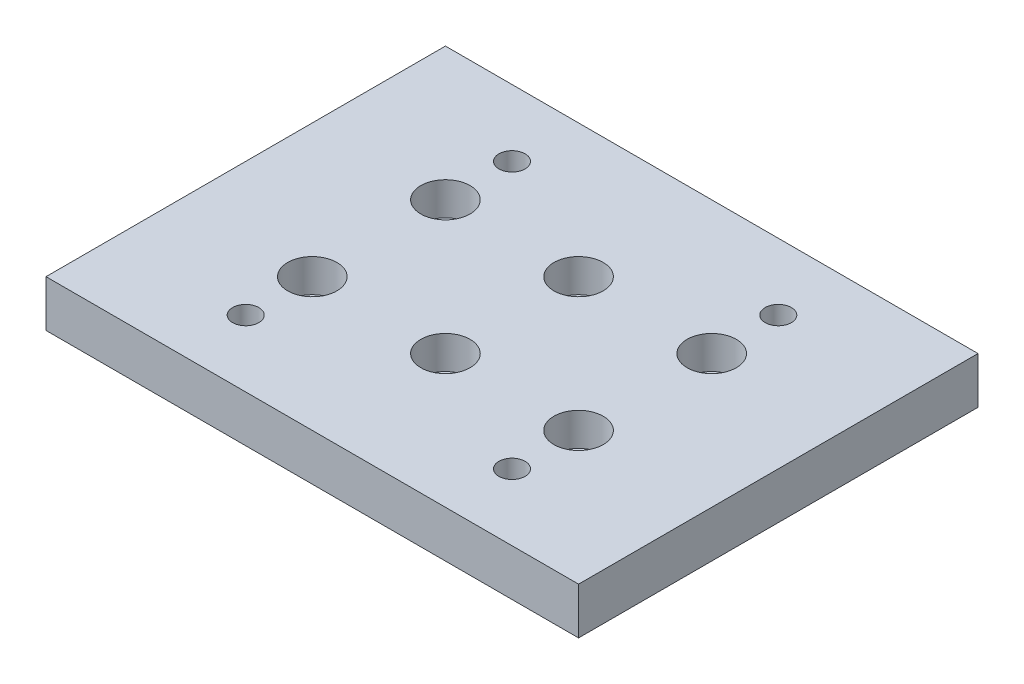
ISO-10303-21;
HEADER;
FILE_DESCRIPTION(('STEP AP214'),'2;1');
FILE_NAME('part.step','',(''),(''),'','','');
FILE_SCHEMA(('AUTOMOTIVE_DESIGN { 1 0 10303 214 1 1 1 1 }'));
ENDSEC;
DATA;
#1=APPLICATION_CONTEXT('core data for automotive mechanical design processes');
#2=APPLICATION_PROTOCOL_DEFINITION('international standard','automotive_design',2000,#1);
#3=PRODUCT_CONTEXT('',#1,'mechanical');
#4=PRODUCT('Part','Part','',(#3));
#5=PRODUCT_RELATED_PRODUCT_CATEGORY('part','',(#4));
#6=PRODUCT_DEFINITION_FORMATION('','',#4);
#7=PRODUCT_DEFINITION_CONTEXT('part definition',#1,'design');
#8=PRODUCT_DEFINITION('design','',#6,#7);
#9=PRODUCT_DEFINITION_SHAPE('','',#8);
#10=(LENGTH_UNIT() NAMED_UNIT(*) SI_UNIT(.MILLI.,.METRE.));
#11=(NAMED_UNIT(*) PLANE_ANGLE_UNIT() SI_UNIT($,.RADIAN.));
#12=(NAMED_UNIT(*) SI_UNIT($,.STERADIAN.) SOLID_ANGLE_UNIT());
#13=UNCERTAINTY_MEASURE_WITH_UNIT(LENGTH_MEASURE(1.E-05),#10,'distance_accuracy_value','');
#14=(GEOMETRIC_REPRESENTATION_CONTEXT(3) GLOBAL_UNCERTAINTY_ASSIGNED_CONTEXT((#13)) GLOBAL_UNIT_ASSIGNED_CONTEXT((#10,
#11,#12)) REPRESENTATION_CONTEXT('',''));
#15=CARTESIAN_POINT('',(0.,0.,0.));
#16=DIRECTION('',(0.,0.,1.));
#17=DIRECTION('',(1.,0.,0.));
#18=AXIS2_PLACEMENT_3D('',#15,#16,#17);
#19=CARTESIAN_POINT('',(-50.8,8.89,-38.1));
#20=DIRECTION('',(1.,0.,0.));
#21=DIRECTION('',(0.,0.,-1.));
#22=AXIS2_PLACEMENT_3D('',#19,#20,#21);
#23=PLANE('',#22);
#24=DIRECTION('',(0.,0.,1.));
#25=VECTOR('',#24,1.);
#26=CARTESIAN_POINT('',(-50.8,0.,-38.1));
#27=LINE('',#26,#25);
#28=CARTESIAN_POINT('',(-50.8,0.,-38.1));
#29=VERTEX_POINT('',#28);
#30=CARTESIAN_POINT('',(-50.8,0.,38.1));
#31=VERTEX_POINT('',#30);
#32=EDGE_CURVE('E114',#29,#31,#27,.T.);
#33=ORIENTED_EDGE('',*,*,#32,.T.);
#34=DIRECTION('',(0.,-1.,0.));
#35=VECTOR('',#34,1.);
#36=CARTESIAN_POINT('',(-50.8,8.89,38.1));
#37=LINE('',#36,#35);
#38=CARTESIAN_POINT('',(-50.8,8.89,38.1));
#39=VERTEX_POINT('',#38);
#40=EDGE_CURVE('E11',#39,#31,#37,.T.);
#41=ORIENTED_EDGE('',*,*,#40,.F.);
#42=DIRECTION('',(0.,0.,1.));
#43=VECTOR('',#42,1.);
#44=CARTESIAN_POINT('',(-50.8,8.89,-38.1));
#45=LINE('',#44,#43);
#46=CARTESIAN_POINT('',(-50.8,8.89,-38.1));
#47=VERTEX_POINT('',#46);
#48=EDGE_CURVE('E96',#47,#39,#45,.T.);
#49=ORIENTED_EDGE('',*,*,#48,.F.);
#50=DIRECTION('',(0.,-1.,0.));
#51=VECTOR('',#50,1.);
#52=CARTESIAN_POINT('',(-50.8,8.89,-38.1));
#53=LINE('',#52,#51);
#54=EDGE_CURVE('E110',#47,#29,#53,.T.);
#55=ORIENTED_EDGE('',*,*,#54,.T.);
#56=EDGE_LOOP('',(#33,#41,#49,#55));
#57=FACE_BOUND('',#56,.T.);
#58=ADVANCED_FACE('F44',(#57),#23,.F.);
#59=CARTESIAN_POINT('',(-50.8,8.89,38.1));
#60=DIRECTION('',(0.,0.,-1.));
#61=DIRECTION('',(-1.,0.,0.));
#62=AXIS2_PLACEMENT_3D('',#59,#60,#61);
#63=PLANE('',#62);
#64=DIRECTION('',(1.,0.,0.));
#65=VECTOR('',#64,1.);
#66=CARTESIAN_POINT('',(-50.8,0.,38.1));
#67=LINE('',#66,#65);
#68=CARTESIAN_POINT('',(50.8,0.,38.1));
#69=VERTEX_POINT('',#68);
#70=EDGE_CURVE('E101',#31,#69,#67,.T.);
#71=ORIENTED_EDGE('',*,*,#70,.T.);
#72=DIRECTION('',(0.,-1.,0.));
#73=VECTOR('',#72,1.);
#74=CARTESIAN_POINT('',(50.8,8.89,38.1));
#75=LINE('',#74,#73);
#76=CARTESIAN_POINT('',(50.8,8.89,38.1));
#77=VERTEX_POINT('',#76);
#78=EDGE_CURVE('E53',#77,#69,#75,.T.);
#79=ORIENTED_EDGE('',*,*,#78,.F.);
#80=DIRECTION('',(1.,0.,0.));
#81=VECTOR('',#80,1.);
#82=CARTESIAN_POINT('',(-50.8,8.89,38.1));
#83=LINE('',#82,#81);
#84=EDGE_CURVE('E91',#39,#77,#83,.T.);
#85=ORIENTED_EDGE('',*,*,#84,.F.);
#86=ORIENTED_EDGE('',*,*,#40,.T.);
#87=EDGE_LOOP('',(#71,#79,#85,#86));
#88=FACE_BOUND('',#87,.T.);
#89=ADVANCED_FACE('F100',(#88),#63,.F.);
#90=CARTESIAN_POINT('',(50.8,8.89,-38.1000000000001));
#91=DIRECTION('',(-1.,0.,0.));
#92=DIRECTION('',(0.,0.,1.));
#93=AXIS2_PLACEMENT_3D('',#90,#91,#92);
#94=PLANE('',#93);
#95=DIRECTION('',(0.,0.,-1.));
#96=VECTOR('',#95,1.);
#97=CARTESIAN_POINT('',(50.8,0.,-38.1000000000001));
#98=LINE('',#97,#96);
#99=CARTESIAN_POINT('',(50.8,0.,-38.1000000000001));
#100=VERTEX_POINT('',#99);
#101=EDGE_CURVE('E78',#69,#100,#98,.T.);
#102=ORIENTED_EDGE('',*,*,#101,.T.);
#103=DIRECTION('',(0.,-1.,0.));
#104=VECTOR('',#103,1.);
#105=CARTESIAN_POINT('',(50.8,8.89,-38.1000000000001));
#106=LINE('',#105,#104);
#107=CARTESIAN_POINT('',(50.8,8.89,-38.1000000000001));
#108=VERTEX_POINT('',#107);
#109=EDGE_CURVE('E103',#108,#100,#106,.T.);
#110=ORIENTED_EDGE('',*,*,#109,.F.);
#111=DIRECTION('',(0.,0.,-1.));
#112=VECTOR('',#111,1.);
#113=CARTESIAN_POINT('',(50.8,8.89,-38.1000000000001));
#114=LINE('',#113,#112);
#115=EDGE_CURVE('E94',#77,#108,#114,.T.);
#116=ORIENTED_EDGE('',*,*,#115,.F.);
#117=ORIENTED_EDGE('',*,*,#78,.T.);
#118=EDGE_LOOP('',(#102,#110,#116,#117));
#119=FACE_BOUND('',#118,.T.);
#120=ADVANCED_FACE('F104',(#119),#94,.F.);
#121=CARTESIAN_POINT('',(-50.8,8.89,-38.1));
#122=DIRECTION('',(0.,0.,1.));
#123=DIRECTION('',(1.,0.,0.));
#124=AXIS2_PLACEMENT_3D('',#121,#122,#123);
#125=PLANE('',#124);
#126=DIRECTION('',(-1.,0.,0.));
#127=VECTOR('',#126,1.);
#128=CARTESIAN_POINT('',(-50.8,0.,-38.1));
#129=LINE('',#128,#127);
#130=EDGE_CURVE('E84',#100,#29,#129,.T.);
#131=ORIENTED_EDGE('',*,*,#130,.T.);
#132=ORIENTED_EDGE('',*,*,#54,.F.);
#133=DIRECTION('',(-1.,0.,0.));
#134=VECTOR('',#133,1.);
#135=CARTESIAN_POINT('',(-50.8,8.89,-38.1));
#136=LINE('',#135,#134);
#137=EDGE_CURVE('E61',#108,#47,#136,.T.);
#138=ORIENTED_EDGE('',*,*,#137,.F.);
#139=ORIENTED_EDGE('',*,*,#109,.T.);
#140=EDGE_LOOP('',(#131,#132,#138,#139));
#141=FACE_BOUND('',#140,.T.);
#142=ADVANCED_FACE('F130',(#141),#125,.F.);
#143=CARTESIAN_POINT('',(0.,8.89,0.));
#144=DIRECTION('',(0.,1.,0.));
#145=DIRECTION('',(0.,0.,1.));
#146=AXIS2_PLACEMENT_3D('',#143,#144,#145);
#147=PLANE('',#146);
#148=CARTESIAN_POINT('',(-25.4,8.89,-12.7000000000001));
#149=DIRECTION('',(0.,1.,0.));
#150=DIRECTION('',(0.,0.,1.));
#151=AXIS2_PLACEMENT_3D('',#148,#149,#150);
#152=CIRCLE('',#151,4.7);
#153=CARTESIAN_POINT('',(-25.4,8.89,-8.00000000000006));
#154=VERTEX_POINT('',#153);
#155=EDGE_CURVE('E262',#154,#154,#152,.T.);
#156=ORIENTED_EDGE('',*,*,#155,.F.);
#157=EDGE_LOOP('',(#156));
#158=FACE_BOUND('',#157,.T.);
#159=CARTESIAN_POINT('',(-25.4,8.89,12.6999999999999));
#160=DIRECTION('',(0.,1.,0.));
#161=DIRECTION('',(0.,0.,1.));
#162=AXIS2_PLACEMENT_3D('',#159,#160,#161);
#163=CIRCLE('',#162,4.7);
#164=CARTESIAN_POINT('',(-25.4,8.89,17.3999999999999));
#165=VERTEX_POINT('',#164);
#166=EDGE_CURVE('E246',#165,#165,#163,.T.);
#167=ORIENTED_EDGE('',*,*,#166,.F.);
#168=EDGE_LOOP('',(#167));
#169=FACE_BOUND('',#168,.T.);
#170=CARTESIAN_POINT('',(0.,8.89,12.6999999999998));
#171=DIRECTION('',(0.,1.,0.));
#172=DIRECTION('',(0.,0.,1.));
#173=AXIS2_PLACEMENT_3D('',#170,#171,#172);
#174=CIRCLE('',#173,4.7);
#175=CARTESIAN_POINT('',(0.,8.89,17.3999999999998));
#176=VERTEX_POINT('',#175);
#177=EDGE_CURVE('E230',#176,#176,#174,.T.);
#178=ORIENTED_EDGE('',*,*,#177,.F.);
#179=EDGE_LOOP('',(#178));
#180=FACE_BOUND('',#179,.T.);
#181=CARTESIAN_POINT('',(0.,8.89,-12.7000000000002));
#182=DIRECTION('',(0.,1.,0.));
#183=DIRECTION('',(0.,0.,1.));
#184=AXIS2_PLACEMENT_3D('',#181,#182,#183);
#185=CIRCLE('',#184,4.7);
#186=CARTESIAN_POINT('',(0.,8.89,-8.00000000000017));
#187=VERTEX_POINT('',#186);
#188=EDGE_CURVE('E214',#187,#187,#185,.T.);
#189=ORIENTED_EDGE('',*,*,#188,.F.);
#190=EDGE_LOOP('',(#189));
#191=FACE_BOUND('',#190,.T.);
#192=CARTESIAN_POINT('',(25.4,8.89,-12.7000000000001));
#193=DIRECTION('',(0.,1.,0.));
#194=DIRECTION('',(0.,0.,1.));
#195=AXIS2_PLACEMENT_3D('',#192,#193,#194);
#196=CIRCLE('',#195,4.7);
#197=CARTESIAN_POINT('',(25.4,8.89,-8.00000000000015));
#198=VERTEX_POINT('',#197);
#199=EDGE_CURVE('E198',#198,#198,#196,.T.);
#200=ORIENTED_EDGE('',*,*,#199,.F.);
#201=EDGE_LOOP('',(#200));
#202=FACE_BOUND('',#201,.T.);
#203=CARTESIAN_POINT('',(25.3999999999999,8.89,12.6999999999999));
#204=DIRECTION('',(0.,1.,0.));
#205=DIRECTION('',(0.,0.,1.));
#206=AXIS2_PLACEMENT_3D('',#203,#204,#205);
#207=CIRCLE('',#206,4.7);
#208=CARTESIAN_POINT('',(25.3999999999999,8.89,17.3999999999998));
#209=VERTEX_POINT('',#208);
#210=EDGE_CURVE('E182',#209,#209,#207,.T.);
#211=ORIENTED_EDGE('',*,*,#210,.F.);
#212=EDGE_LOOP('',(#211));
#213=FACE_BOUND('',#212,.T.);
#214=CARTESIAN_POINT('',(-25.4,8.89,-25.4000000000001));
#215=DIRECTION('',(0.,1.,0.));
#216=DIRECTION('',(0.,0.,1.));
#217=AXIS2_PLACEMENT_3D('',#214,#215,#216);
#218=CIRCLE('',#217,2.5);
#219=CARTESIAN_POINT('',(-25.4,8.89,-22.9000000000001));
#220=VERTEX_POINT('',#219);
#221=EDGE_CURVE('E166',#220,#220,#218,.T.);
#222=ORIENTED_EDGE('',*,*,#221,.F.);
#223=EDGE_LOOP('',(#222));
#224=FACE_BOUND('',#223,.T.);
#225=CARTESIAN_POINT('',(25.4,8.89,-25.4000000000001));
#226=DIRECTION('',(0.,1.,0.));
#227=DIRECTION('',(0.,0.,1.));
#228=AXIS2_PLACEMENT_3D('',#225,#226,#227);
#229=CIRCLE('',#228,2.5);
#230=CARTESIAN_POINT('',(25.4,8.89,-22.9000000000001));
#231=VERTEX_POINT('',#230);
#232=EDGE_CURVE('E158',#231,#231,#229,.T.);
#233=ORIENTED_EDGE('',*,*,#232,.F.);
#234=EDGE_LOOP('',(#233));
#235=FACE_BOUND('',#234,.T.);
#236=CARTESIAN_POINT('',(25.4,8.89,25.3999999999999));
#237=DIRECTION('',(0.,1.,0.));
#238=DIRECTION('',(0.,0.,1.));
#239=AXIS2_PLACEMENT_3D('',#236,#237,#238);
#240=CIRCLE('',#239,2.5);
#241=CARTESIAN_POINT('',(25.4,8.89,27.8999999999999));
#242=VERTEX_POINT('',#241);
#243=EDGE_CURVE('E150',#242,#242,#240,.T.);
#244=ORIENTED_EDGE('',*,*,#243,.F.);
#245=EDGE_LOOP('',(#244));
#246=FACE_BOUND('',#245,.T.);
#247=CARTESIAN_POINT('',(-25.4,8.89,25.3999999999999));
#248=DIRECTION('',(0.,1.,0.));
#249=DIRECTION('',(0.,0.,1.));
#250=AXIS2_PLACEMENT_3D('',#247,#248,#249);
#251=CIRCLE('',#250,2.5);
#252=CARTESIAN_POINT('',(-25.4,8.89,27.8999999999999));
#253=VERTEX_POINT('',#252);
#254=EDGE_CURVE('E142',#253,#253,#251,.T.);
#255=ORIENTED_EDGE('',*,*,#254,.F.);
#256=EDGE_LOOP('',(#255));
#257=FACE_BOUND('',#256,.T.);
#258=ORIENTED_EDGE('',*,*,#48,.T.);
#259=ORIENTED_EDGE('',*,*,#84,.T.);
#260=ORIENTED_EDGE('',*,*,#115,.T.);
#261=ORIENTED_EDGE('',*,*,#137,.T.);
#262=EDGE_LOOP('',(#258,#259,#260,#261));
#263=FACE_BOUND('',#262,.T.);
#264=ADVANCED_FACE('F92',(#158,#169,#180,#191,#202,#213,#224,#235,#246,#257,#263),#147,.T.);
#265=CARTESIAN_POINT('',(0.,0.,0.));
#266=DIRECTION('',(0.,1.,0.));
#267=DIRECTION('',(0.,0.,1.));
#268=AXIS2_PLACEMENT_3D('',#265,#266,#267);
#269=PLANE('',#268);
#270=CARTESIAN_POINT('',(-25.4,0.,-12.7000000000001));
#271=DIRECTION('',(0.,1.,0.));
#272=DIRECTION('',(0.,0.,1.));
#273=AXIS2_PLACEMENT_3D('',#270,#271,#272);
#274=CIRCLE('',#273,3.3);
#275=CARTESIAN_POINT('',(-25.4,0.,-9.40000000000005));
#276=VERTEX_POINT('',#275);
#277=EDGE_CURVE('E250',#276,#276,#274,.T.);
#278=ORIENTED_EDGE('',*,*,#277,.T.);
#279=EDGE_LOOP('',(#278));
#280=FACE_BOUND('',#279,.T.);
#281=CARTESIAN_POINT('',(-25.4,0.,12.6999999999999));
#282=DIRECTION('',(0.,1.,0.));
#283=DIRECTION('',(0.,0.,1.));
#284=AXIS2_PLACEMENT_3D('',#281,#282,#283);
#285=CIRCLE('',#284,3.3);
#286=CARTESIAN_POINT('',(-25.4,0.,15.9999999999999));
#287=VERTEX_POINT('',#286);
#288=EDGE_CURVE('E234',#287,#287,#285,.T.);
#289=ORIENTED_EDGE('',*,*,#288,.T.);
#290=EDGE_LOOP('',(#289));
#291=FACE_BOUND('',#290,.T.);
#292=CARTESIAN_POINT('',(0.,0.,12.6999999999998));
#293=DIRECTION('',(0.,1.,0.));
#294=DIRECTION('',(0.,0.,1.));
#295=AXIS2_PLACEMENT_3D('',#292,#293,#294);
#296=CIRCLE('',#295,3.3);
#297=CARTESIAN_POINT('',(0.,0.,15.9999999999998));
#298=VERTEX_POINT('',#297);
#299=EDGE_CURVE('E218',#298,#298,#296,.T.);
#300=ORIENTED_EDGE('',*,*,#299,.T.);
#301=EDGE_LOOP('',(#300));
#302=FACE_BOUND('',#301,.T.);
#303=CARTESIAN_POINT('',(0.,0.,-12.7000000000002));
#304=DIRECTION('',(0.,1.,0.));
#305=DIRECTION('',(0.,0.,1.));
#306=AXIS2_PLACEMENT_3D('',#303,#304,#305);
#307=CIRCLE('',#306,3.3);
#308=CARTESIAN_POINT('',(0.,0.,-9.40000000000017));
#309=VERTEX_POINT('',#308);
#310=EDGE_CURVE('E202',#309,#309,#307,.T.);
#311=ORIENTED_EDGE('',*,*,#310,.T.);
#312=EDGE_LOOP('',(#311));
#313=FACE_BOUND('',#312,.T.);
#314=CARTESIAN_POINT('',(25.4,0.,-12.7000000000001));
#315=DIRECTION('',(0.,1.,0.));
#316=DIRECTION('',(0.,0.,1.));
#317=AXIS2_PLACEMENT_3D('',#314,#315,#316);
#318=CIRCLE('',#317,3.3);
#319=CARTESIAN_POINT('',(25.4,0.,-9.40000000000015));
#320=VERTEX_POINT('',#319);
#321=EDGE_CURVE('E186',#320,#320,#318,.T.);
#322=ORIENTED_EDGE('',*,*,#321,.T.);
#323=EDGE_LOOP('',(#322));
#324=FACE_BOUND('',#323,.T.);
#325=CARTESIAN_POINT('',(25.3999999999999,0.,12.6999999999999));
#326=DIRECTION('',(0.,1.,0.));
#327=DIRECTION('',(0.,0.,1.));
#328=AXIS2_PLACEMENT_3D('',#325,#326,#327);
#329=CIRCLE('',#328,3.3);
#330=CARTESIAN_POINT('',(25.3999999999999,0.,15.9999999999999));
#331=VERTEX_POINT('',#330);
#332=EDGE_CURVE('E170',#331,#331,#329,.T.);
#333=ORIENTED_EDGE('',*,*,#332,.T.);
#334=EDGE_LOOP('',(#333));
#335=FACE_BOUND('',#334,.T.);
#336=CARTESIAN_POINT('',(-25.4,0.,-25.4000000000001));
#337=DIRECTION('',(0.,1.,0.));
#338=DIRECTION('',(0.,0.,1.));
#339=AXIS2_PLACEMENT_3D('',#336,#337,#338);
#340=CIRCLE('',#339,2.5);
#341=CARTESIAN_POINT('',(-25.4,0.,-22.9000000000001));
#342=VERTEX_POINT('',#341);
#343=EDGE_CURVE('E162',#342,#342,#340,.T.);
#344=ORIENTED_EDGE('',*,*,#343,.T.);
#345=EDGE_LOOP('',(#344));
#346=FACE_BOUND('',#345,.T.);
#347=CARTESIAN_POINT('',(25.4,0.,-25.4000000000001));
#348=DIRECTION('',(0.,1.,0.));
#349=DIRECTION('',(0.,0.,1.));
#350=AXIS2_PLACEMENT_3D('',#347,#348,#349);
#351=CIRCLE('',#350,2.5);
#352=CARTESIAN_POINT('',(25.4,0.,-22.9000000000001));
#353=VERTEX_POINT('',#352);
#354=EDGE_CURVE('E154',#353,#353,#351,.T.);
#355=ORIENTED_EDGE('',*,*,#354,.T.);
#356=EDGE_LOOP('',(#355));
#357=FACE_BOUND('',#356,.T.);
#358=CARTESIAN_POINT('',(25.4,0.,25.3999999999999));
#359=DIRECTION('',(0.,1.,0.));
#360=DIRECTION('',(0.,0.,1.));
#361=AXIS2_PLACEMENT_3D('',#358,#359,#360);
#362=CIRCLE('',#361,2.5);
#363=CARTESIAN_POINT('',(25.4,0.,27.8999999999999));
#364=VERTEX_POINT('',#363);
#365=EDGE_CURVE('E146',#364,#364,#362,.T.);
#366=ORIENTED_EDGE('',*,*,#365,.T.);
#367=EDGE_LOOP('',(#366));
#368=FACE_BOUND('',#367,.T.);
#369=CARTESIAN_POINT('',(-25.4,0.,25.3999999999999));
#370=DIRECTION('',(0.,1.,0.));
#371=DIRECTION('',(0.,0.,1.));
#372=AXIS2_PLACEMENT_3D('',#369,#370,#371);
#373=CIRCLE('',#372,2.5);
#374=CARTESIAN_POINT('',(-25.4,0.,27.8999999999999));
#375=VERTEX_POINT('',#374);
#376=EDGE_CURVE('E118',#375,#375,#373,.T.);
#377=ORIENTED_EDGE('',*,*,#376,.T.);
#378=EDGE_LOOP('',(#377));
#379=FACE_BOUND('',#378,.T.);
#380=ORIENTED_EDGE('',*,*,#32,.F.);
#381=ORIENTED_EDGE('',*,*,#130,.F.);
#382=ORIENTED_EDGE('',*,*,#101,.F.);
#383=ORIENTED_EDGE('',*,*,#70,.F.);
#384=EDGE_LOOP('',(#380,#381,#382,#383));
#385=FACE_BOUND('',#384,.T.);
#386=ADVANCED_FACE('F133',(#280,#291,#302,#313,#324,#335,#346,#357,#368,#379,#385),#269,.F.);
#387=CARTESIAN_POINT('',(-25.4,8.89,25.3999999999999));
#388=DIRECTION('',(0.,1.,0.));
#389=DIRECTION('',(0.,0.,1.));
#390=AXIS2_PLACEMENT_3D('',#387,#388,#389);
#391=CYLINDRICAL_SURFACE('',#390,2.5);
#392=ORIENTED_EDGE('',*,*,#376,.F.);
#393=EDGE_LOOP('',(#392));
#394=FACE_BOUND('',#393,.T.);
#395=ORIENTED_EDGE('',*,*,#254,.T.);
#396=EDGE_LOOP('',(#395));
#397=FACE_BOUND('',#396,.T.);
#398=ADVANCED_FACE('F292',(#394,#397),#391,.F.);
#399=CARTESIAN_POINT('',(25.4,8.89,25.3999999999999));
#400=DIRECTION('',(0.,1.,0.));
#401=DIRECTION('',(0.,0.,1.));
#402=AXIS2_PLACEMENT_3D('',#399,#400,#401);
#403=CYLINDRICAL_SURFACE('',#402,2.5);
#404=ORIENTED_EDGE('',*,*,#365,.F.);
#405=EDGE_LOOP('',(#404));
#406=FACE_BOUND('',#405,.T.);
#407=ORIENTED_EDGE('',*,*,#243,.T.);
#408=EDGE_LOOP('',(#407));
#409=FACE_BOUND('',#408,.T.);
#410=ADVANCED_FACE('F294',(#406,#409),#403,.F.);
#411=CARTESIAN_POINT('',(25.4,8.89,-25.4000000000001));
#412=DIRECTION('',(0.,1.,0.));
#413=DIRECTION('',(0.,0.,1.));
#414=AXIS2_PLACEMENT_3D('',#411,#412,#413);
#415=CYLINDRICAL_SURFACE('',#414,2.5);
#416=ORIENTED_EDGE('',*,*,#354,.F.);
#417=EDGE_LOOP('',(#416));
#418=FACE_BOUND('',#417,.T.);
#419=ORIENTED_EDGE('',*,*,#232,.T.);
#420=EDGE_LOOP('',(#419));
#421=FACE_BOUND('',#420,.T.);
#422=ADVANCED_FACE('F301',(#418,#421),#415,.F.);
#423=CARTESIAN_POINT('',(-25.4,8.89,-25.4000000000001));
#424=DIRECTION('',(0.,1.,0.));
#425=DIRECTION('',(0.,0.,1.));
#426=AXIS2_PLACEMENT_3D('',#423,#424,#425);
#427=CYLINDRICAL_SURFACE('',#426,2.5);
#428=ORIENTED_EDGE('',*,*,#343,.F.);
#429=EDGE_LOOP('',(#428));
#430=FACE_BOUND('',#429,.T.);
#431=ORIENTED_EDGE('',*,*,#221,.T.);
#432=EDGE_LOOP('',(#431));
#433=FACE_BOUND('',#432,.T.);
#434=ADVANCED_FACE('F343',(#430,#433),#427,.F.);
#435=CARTESIAN_POINT('',(25.3999999999999,8.89,12.6999999999999));
#436=DIRECTION('',(0.,1.,0.));
#437=DIRECTION('',(0.,0.,1.));
#438=AXIS2_PLACEMENT_3D('',#435,#436,#437);
#439=CYLINDRICAL_SURFACE('',#438,3.3);
#440=ORIENTED_EDGE('',*,*,#332,.F.);
#441=EDGE_LOOP('',(#440));
#442=FACE_BOUND('',#441,.T.);
#443=CARTESIAN_POINT('',(25.3999999999999,2.59,12.6999999999999));
#444=DIRECTION('',(0.,1.,0.));
#445=DIRECTION('',(0.,0.,1.));
#446=AXIS2_PLACEMENT_3D('',#443,#444,#445);
#447=CIRCLE('',#446,3.3);
#448=CARTESIAN_POINT('',(25.3999999999999,2.59,15.9999999999999));
#449=VERTEX_POINT('',#448);
#450=EDGE_CURVE('E174',#449,#449,#447,.T.);
#451=ORIENTED_EDGE('',*,*,#450,.T.);
#452=EDGE_LOOP('',(#451));
#453=FACE_BOUND('',#452,.T.);
#454=ADVANCED_FACE('F337',(#442,#453),#439,.F.);
#455=CARTESIAN_POINT('',(28.6999999999999,2.59,12.6999999999999));
#456=DIRECTION('',(0.,-1.,0.));
#457=DIRECTION('',(0.,0.,-1.));
#458=AXIS2_PLACEMENT_3D('',#455,#456,#457);
#459=PLANE('',#458);
#460=ORIENTED_EDGE('',*,*,#450,.F.);
#461=EDGE_LOOP('',(#460));
#462=FACE_BOUND('',#461,.T.);
#463=CARTESIAN_POINT('',(25.3999999999999,2.59,12.6999999999999));
#464=DIRECTION('',(0.,1.,0.));
#465=DIRECTION('',(0.,0.,1.));
#466=AXIS2_PLACEMENT_3D('',#463,#464,#465);
#467=CIRCLE('',#466,4.7);
#468=CARTESIAN_POINT('',(25.3999999999999,2.59,17.3999999999998));
#469=VERTEX_POINT('',#468);
#470=EDGE_CURVE('E178',#469,#469,#467,.T.);
#471=ORIENTED_EDGE('',*,*,#470,.T.);
#472=EDGE_LOOP('',(#471));
#473=FACE_BOUND('',#472,.T.);
#474=ADVANCED_FACE('F342',(#462,#473),#459,.F.);
#475=CARTESIAN_POINT('',(25.3999999999999,8.89,12.6999999999999));
#476=DIRECTION('',(0.,1.,0.));
#477=DIRECTION('',(0.,0.,1.));
#478=AXIS2_PLACEMENT_3D('',#475,#476,#477);
#479=CYLINDRICAL_SURFACE('',#478,4.7);
#480=ORIENTED_EDGE('',*,*,#470,.F.);
#481=EDGE_LOOP('',(#480));
#482=FACE_BOUND('',#481,.T.);
#483=ORIENTED_EDGE('',*,*,#210,.T.);
#484=EDGE_LOOP('',(#483));
#485=FACE_BOUND('',#484,.T.);
#486=ADVANCED_FACE('F356',(#482,#485),#479,.F.);
#487=CARTESIAN_POINT('',(25.4,8.89,-12.7000000000001));
#488=DIRECTION('',(0.,1.,0.));
#489=DIRECTION('',(0.,0.,1.));
#490=AXIS2_PLACEMENT_3D('',#487,#488,#489);
#491=CYLINDRICAL_SURFACE('',#490,3.3);
#492=ORIENTED_EDGE('',*,*,#321,.F.);
#493=EDGE_LOOP('',(#492));
#494=FACE_BOUND('',#493,.T.);
#495=CARTESIAN_POINT('',(25.4,2.59,-12.7000000000001));
#496=DIRECTION('',(0.,1.,0.));
#497=DIRECTION('',(0.,0.,1.));
#498=AXIS2_PLACEMENT_3D('',#495,#496,#497);
#499=CIRCLE('',#498,3.3);
#500=CARTESIAN_POINT('',(25.4,2.59,-9.40000000000015));
#501=VERTEX_POINT('',#500);
#502=EDGE_CURVE('E190',#501,#501,#499,.T.);
#503=ORIENTED_EDGE('',*,*,#502,.T.);
#504=EDGE_LOOP('',(#503));
#505=FACE_BOUND('',#504,.T.);
#506=ADVANCED_FACE('F367',(#494,#505),#491,.F.);
#507=CARTESIAN_POINT('',(28.7,2.59,-12.7000000000001));
#508=DIRECTION('',(0.,-1.,0.));
#509=DIRECTION('',(0.,0.,-1.));
#510=AXIS2_PLACEMENT_3D('',#507,#508,#509);
#511=PLANE('',#510);
#512=ORIENTED_EDGE('',*,*,#502,.F.);
#513=EDGE_LOOP('',(#512));
#514=FACE_BOUND('',#513,.T.);
#515=CARTESIAN_POINT('',(25.4,2.59,-12.7000000000001));
#516=DIRECTION('',(0.,1.,0.));
#517=DIRECTION('',(0.,0.,1.));
#518=AXIS2_PLACEMENT_3D('',#515,#516,#517);
#519=CIRCLE('',#518,4.7);
#520=CARTESIAN_POINT('',(25.4,2.59,-8.00000000000015));
#521=VERTEX_POINT('',#520);
#522=EDGE_CURVE('E194',#521,#521,#519,.T.);
#523=ORIENTED_EDGE('',*,*,#522,.T.);
#524=EDGE_LOOP('',(#523));
#525=FACE_BOUND('',#524,.T.);
#526=ADVANCED_FACE('F378',(#514,#525),#511,.F.);
#527=CARTESIAN_POINT('',(25.4,8.89,-12.7000000000001));
#528=DIRECTION('',(0.,1.,0.));
#529=DIRECTION('',(0.,0.,1.));
#530=AXIS2_PLACEMENT_3D('',#527,#528,#529);
#531=CYLINDRICAL_SURFACE('',#530,4.7);
#532=ORIENTED_EDGE('',*,*,#522,.F.);
#533=EDGE_LOOP('',(#532));
#534=FACE_BOUND('',#533,.T.);
#535=ORIENTED_EDGE('',*,*,#199,.T.);
#536=EDGE_LOOP('',(#535));
#537=FACE_BOUND('',#536,.T.);
#538=ADVANCED_FACE('F389',(#534,#537),#531,.F.);
#539=CARTESIAN_POINT('',(0.,8.89,-12.7000000000002));
#540=DIRECTION('',(0.,1.,0.));
#541=DIRECTION('',(0.,0.,1.));
#542=AXIS2_PLACEMENT_3D('',#539,#540,#541);
#543=CYLINDRICAL_SURFACE('',#542,3.3);
#544=ORIENTED_EDGE('',*,*,#310,.F.);
#545=EDGE_LOOP('',(#544));
#546=FACE_BOUND('',#545,.T.);
#547=CARTESIAN_POINT('',(0.,2.59,-12.7000000000002));
#548=DIRECTION('',(0.,1.,0.));
#549=DIRECTION('',(0.,0.,1.));
#550=AXIS2_PLACEMENT_3D('',#547,#548,#549);
#551=CIRCLE('',#550,3.3);
#552=CARTESIAN_POINT('',(0.,2.59,-9.40000000000017));
#553=VERTEX_POINT('',#552);
#554=EDGE_CURVE('E206',#553,#553,#551,.T.);
#555=ORIENTED_EDGE('',*,*,#554,.T.);
#556=EDGE_LOOP('',(#555));
#557=FACE_BOUND('',#556,.T.);
#558=ADVANCED_FACE('F400',(#546,#557),#543,.F.);
#559=CARTESIAN_POINT('',(3.29999999999996,2.59,-12.7000000000002));
#560=DIRECTION('',(0.,-1.,0.));
#561=DIRECTION('',(0.,0.,-1.));
#562=AXIS2_PLACEMENT_3D('',#559,#560,#561);
#563=PLANE('',#562);
#564=ORIENTED_EDGE('',*,*,#554,.F.);
#565=EDGE_LOOP('',(#564));
#566=FACE_BOUND('',#565,.T.);
#567=CARTESIAN_POINT('',(0.,2.59,-12.7000000000002));
#568=DIRECTION('',(0.,1.,0.));
#569=DIRECTION('',(0.,0.,1.));
#570=AXIS2_PLACEMENT_3D('',#567,#568,#569);
#571=CIRCLE('',#570,4.7);
#572=CARTESIAN_POINT('',(0.,2.59,-8.00000000000017));
#573=VERTEX_POINT('',#572);
#574=EDGE_CURVE('E210',#573,#573,#571,.T.);
#575=ORIENTED_EDGE('',*,*,#574,.T.);
#576=EDGE_LOOP('',(#575));
#577=FACE_BOUND('',#576,.T.);
#578=ADVANCED_FACE('F411',(#566,#577),#563,.F.);
#579=CARTESIAN_POINT('',(0.,8.89,-12.7000000000002));
#580=DIRECTION('',(0.,1.,0.));
#581=DIRECTION('',(0.,0.,1.));
#582=AXIS2_PLACEMENT_3D('',#579,#580,#581);
#583=CYLINDRICAL_SURFACE('',#582,4.7);
#584=ORIENTED_EDGE('',*,*,#574,.F.);
#585=EDGE_LOOP('',(#584));
#586=FACE_BOUND('',#585,.T.);
#587=ORIENTED_EDGE('',*,*,#188,.T.);
#588=EDGE_LOOP('',(#587));
#589=FACE_BOUND('',#588,.T.);
#590=ADVANCED_FACE('F422',(#586,#589),#583,.F.);
#591=CARTESIAN_POINT('',(0.,8.89,12.6999999999998));
#592=DIRECTION('',(0.,1.,0.));
#593=DIRECTION('',(0.,0.,1.));
#594=AXIS2_PLACEMENT_3D('',#591,#592,#593);
#595=CYLINDRICAL_SURFACE('',#594,3.3);
#596=ORIENTED_EDGE('',*,*,#299,.F.);
#597=EDGE_LOOP('',(#596));
#598=FACE_BOUND('',#597,.T.);
#599=CARTESIAN_POINT('',(0.,2.59,12.6999999999998));
#600=DIRECTION('',(0.,1.,0.));
#601=DIRECTION('',(0.,0.,1.));
#602=AXIS2_PLACEMENT_3D('',#599,#600,#601);
#603=CIRCLE('',#602,3.3);
#604=CARTESIAN_POINT('',(0.,2.59,15.9999999999998));
#605=VERTEX_POINT('',#604);
#606=EDGE_CURVE('E222',#605,#605,#603,.T.);
#607=ORIENTED_EDGE('',*,*,#606,.T.);
#608=EDGE_LOOP('',(#607));
#609=FACE_BOUND('',#608,.T.);
#610=ADVANCED_FACE('F433',(#598,#609),#595,.F.);
#611=CARTESIAN_POINT('',(3.29999999999995,2.59,12.6999999999998));
#612=DIRECTION('',(0.,-1.,0.));
#613=DIRECTION('',(0.,0.,-1.));
#614=AXIS2_PLACEMENT_3D('',#611,#612,#613);
#615=PLANE('',#614);
#616=ORIENTED_EDGE('',*,*,#606,.F.);
#617=EDGE_LOOP('',(#616));
#618=FACE_BOUND('',#617,.T.);
#619=CARTESIAN_POINT('',(0.,2.59,12.6999999999998));
#620=DIRECTION('',(0.,1.,0.));
#621=DIRECTION('',(0.,0.,1.));
#622=AXIS2_PLACEMENT_3D('',#619,#620,#621);
#623=CIRCLE('',#622,4.7);
#624=CARTESIAN_POINT('',(0.,2.59,17.3999999999998));
#625=VERTEX_POINT('',#624);
#626=EDGE_CURVE('E226',#625,#625,#623,.T.);
#627=ORIENTED_EDGE('',*,*,#626,.T.);
#628=EDGE_LOOP('',(#627));
#629=FACE_BOUND('',#628,.T.);
#630=ADVANCED_FACE('F444',(#618,#629),#615,.F.);
#631=CARTESIAN_POINT('',(0.,8.89,12.6999999999998));
#632=DIRECTION('',(0.,1.,0.));
#633=DIRECTION('',(0.,0.,1.));
#634=AXIS2_PLACEMENT_3D('',#631,#632,#633);
#635=CYLINDRICAL_SURFACE('',#634,4.7);
#636=ORIENTED_EDGE('',*,*,#626,.F.);
#637=EDGE_LOOP('',(#636));
#638=FACE_BOUND('',#637,.T.);
#639=ORIENTED_EDGE('',*,*,#177,.T.);
#640=EDGE_LOOP('',(#639));
#641=FACE_BOUND('',#640,.T.);
#642=ADVANCED_FACE('F455',(#638,#641),#635,.F.);
#643=CARTESIAN_POINT('',(-25.4,8.89,12.6999999999999));
#644=DIRECTION('',(0.,1.,0.));
#645=DIRECTION('',(0.,0.,1.));
#646=AXIS2_PLACEMENT_3D('',#643,#644,#645);
#647=CYLINDRICAL_SURFACE('',#646,3.3);
#648=ORIENTED_EDGE('',*,*,#288,.F.);
#649=EDGE_LOOP('',(#648));
#650=FACE_BOUND('',#649,.T.);
#651=CARTESIAN_POINT('',(-25.4,2.59,12.6999999999999));
#652=DIRECTION('',(0.,1.,0.));
#653=DIRECTION('',(0.,0.,1.));
#654=AXIS2_PLACEMENT_3D('',#651,#652,#653);
#655=CIRCLE('',#654,3.3);
#656=CARTESIAN_POINT('',(-25.4,2.59,15.9999999999999));
#657=VERTEX_POINT('',#656);
#658=EDGE_CURVE('E238',#657,#657,#655,.T.);
#659=ORIENTED_EDGE('',*,*,#658,.T.);
#660=EDGE_LOOP('',(#659));
#661=FACE_BOUND('',#660,.T.);
#662=ADVANCED_FACE('F466',(#650,#661),#647,.F.);
#663=CARTESIAN_POINT('',(-22.1000000000001,2.59,12.6999999999999));
#664=DIRECTION('',(0.,-1.,0.));
#665=DIRECTION('',(0.,0.,-1.));
#666=AXIS2_PLACEMENT_3D('',#663,#664,#665);
#667=PLANE('',#666);
#668=ORIENTED_EDGE('',*,*,#658,.F.);
#669=EDGE_LOOP('',(#668));
#670=FACE_BOUND('',#669,.T.);
#671=CARTESIAN_POINT('',(-25.4,2.59,12.6999999999999));
#672=DIRECTION('',(0.,1.,0.));
#673=DIRECTION('',(0.,0.,1.));
#674=AXIS2_PLACEMENT_3D('',#671,#672,#673);
#675=CIRCLE('',#674,4.7);
#676=CARTESIAN_POINT('',(-25.4,2.59,17.3999999999999));
#677=VERTEX_POINT('',#676);
#678=EDGE_CURVE('E242',#677,#677,#675,.T.);
#679=ORIENTED_EDGE('',*,*,#678,.T.);
#680=EDGE_LOOP('',(#679));
#681=FACE_BOUND('',#680,.T.);
#682=ADVANCED_FACE('F477',(#670,#681),#667,.F.);
#683=CARTESIAN_POINT('',(-25.4,8.89,12.6999999999999));
#684=DIRECTION('',(0.,1.,0.));
#685=DIRECTION('',(0.,0.,1.));
#686=AXIS2_PLACEMENT_3D('',#683,#684,#685);
#687=CYLINDRICAL_SURFACE('',#686,4.7);
#688=ORIENTED_EDGE('',*,*,#678,.F.);
#689=EDGE_LOOP('',(#688));
#690=FACE_BOUND('',#689,.T.);
#691=ORIENTED_EDGE('',*,*,#166,.T.);
#692=EDGE_LOOP('',(#691));
#693=FACE_BOUND('',#692,.T.);
#694=ADVANCED_FACE('F488',(#690,#693),#687,.F.);
#695=CARTESIAN_POINT('',(-25.4,8.89,-12.7000000000001));
#696=DIRECTION('',(0.,1.,0.));
#697=DIRECTION('',(0.,0.,1.));
#698=AXIS2_PLACEMENT_3D('',#695,#696,#697);
#699=CYLINDRICAL_SURFACE('',#698,3.3);
#700=ORIENTED_EDGE('',*,*,#277,.F.);
#701=EDGE_LOOP('',(#700));
#702=FACE_BOUND('',#701,.T.);
#703=CARTESIAN_POINT('',(-25.4,2.59,-12.7000000000001));
#704=DIRECTION('',(0.,1.,0.));
#705=DIRECTION('',(0.,0.,1.));
#706=AXIS2_PLACEMENT_3D('',#703,#704,#705);
#707=CIRCLE('',#706,3.3);
#708=CARTESIAN_POINT('',(-25.4,2.59,-9.40000000000005));
#709=VERTEX_POINT('',#708);
#710=EDGE_CURVE('E254',#709,#709,#707,.T.);
#711=ORIENTED_EDGE('',*,*,#710,.T.);
#712=EDGE_LOOP('',(#711));
#713=FACE_BOUND('',#712,.T.);
#714=ADVANCED_FACE('F499',(#702,#713),#699,.F.);
#715=CARTESIAN_POINT('',(-22.1,2.59,-12.7000000000001));
#716=DIRECTION('',(0.,-1.,0.));
#717=DIRECTION('',(0.,0.,-1.));
#718=AXIS2_PLACEMENT_3D('',#715,#716,#717);
#719=PLANE('',#718);
#720=ORIENTED_EDGE('',*,*,#710,.F.);
#721=EDGE_LOOP('',(#720));
#722=FACE_BOUND('',#721,.T.);
#723=CARTESIAN_POINT('',(-25.4,2.59,-12.7000000000001));
#724=DIRECTION('',(0.,1.,0.));
#725=DIRECTION('',(0.,0.,1.));
#726=AXIS2_PLACEMENT_3D('',#723,#724,#725);
#727=CIRCLE('',#726,4.7);
#728=CARTESIAN_POINT('',(-25.4,2.59,-8.00000000000006));
#729=VERTEX_POINT('',#728);
#730=EDGE_CURVE('E258',#729,#729,#727,.T.);
#731=ORIENTED_EDGE('',*,*,#730,.T.);
#732=EDGE_LOOP('',(#731));
#733=FACE_BOUND('',#732,.T.);
#734=ADVANCED_FACE('F510',(#722,#733),#719,.F.);
#735=CARTESIAN_POINT('',(-25.4,8.89,-12.7000000000001));
#736=DIRECTION('',(0.,1.,0.));
#737=DIRECTION('',(0.,0.,1.));
#738=AXIS2_PLACEMENT_3D('',#735,#736,#737);
#739=CYLINDRICAL_SURFACE('',#738,4.7);
#740=ORIENTED_EDGE('',*,*,#730,.F.);
#741=EDGE_LOOP('',(#740));
#742=FACE_BOUND('',#741,.T.);
#743=ORIENTED_EDGE('',*,*,#155,.T.);
#744=EDGE_LOOP('',(#743));
#745=FACE_BOUND('',#744,.T.);
#746=ADVANCED_FACE('F269',(#742,#745),#739,.F.);
#747=CLOSED_SHELL('',(#58,#89,#120,#142,#264,#386,#398,#410,#422,#434,#454,#474,#486,#506,#526,
#538,#558,#578,#590,#610,#630,#642,#662,#682,#694,#714,#734,#746));
#748=MANIFOLD_SOLID_BREP('B2',#747);
#749=ADVANCED_BREP_SHAPE_REPRESENTATION('',(#18,#748),#14);
#750=SHAPE_DEFINITION_REPRESENTATION(#9,#749);
ENDSEC;
END-ISO-10303-21;
